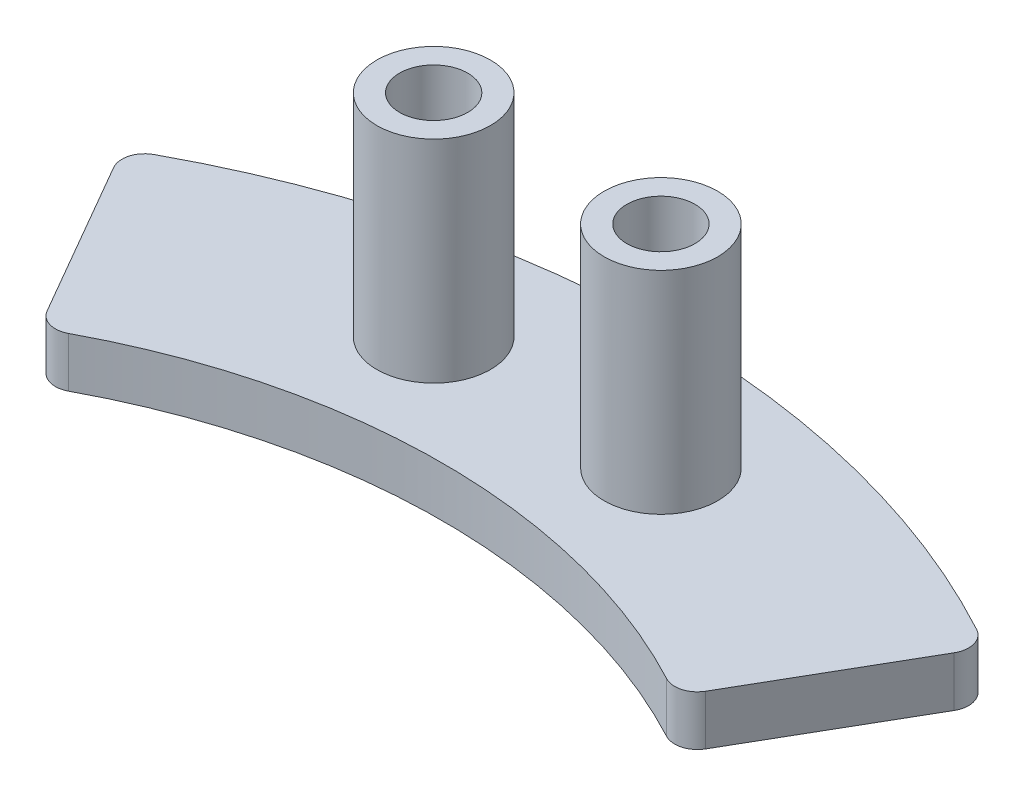
ISO-10303-21;
HEADER;
FILE_DESCRIPTION(('STEP AP214'),'2;1');
FILE_NAME('part.step','',(''),(''),'','','');
FILE_SCHEMA(('AUTOMOTIVE_DESIGN { 1 0 10303 214 1 1 1 1 }'));
ENDSEC;
DATA;
#1=APPLICATION_CONTEXT('core data for automotive mechanical design processes');
#2=APPLICATION_PROTOCOL_DEFINITION('international standard','automotive_design',2000,#1);
#3=PRODUCT_CONTEXT('',#1,'mechanical');
#4=PRODUCT('Part','Part','',(#3));
#5=PRODUCT_RELATED_PRODUCT_CATEGORY('part','',(#4));
#6=PRODUCT_DEFINITION_FORMATION('','',#4);
#7=PRODUCT_DEFINITION_CONTEXT('part definition',#1,'design');
#8=PRODUCT_DEFINITION('design','',#6,#7);
#9=PRODUCT_DEFINITION_SHAPE('','',#8);
#10=(LENGTH_UNIT() NAMED_UNIT(*) SI_UNIT(.MILLI.,.METRE.));
#11=(NAMED_UNIT(*) PLANE_ANGLE_UNIT() SI_UNIT($,.RADIAN.));
#12=(NAMED_UNIT(*) SI_UNIT($,.STERADIAN.) SOLID_ANGLE_UNIT());
#13=UNCERTAINTY_MEASURE_WITH_UNIT(LENGTH_MEASURE(1.E-05),#10,'distance_accuracy_value','');
#14=(GEOMETRIC_REPRESENTATION_CONTEXT(3) GLOBAL_UNCERTAINTY_ASSIGNED_CONTEXT((#13)) GLOBAL_UNIT_ASSIGNED_CONTEXT((#10,
#11,#12)) REPRESENTATION_CONTEXT('',''));
#15=CARTESIAN_POINT('',(0.,0.,0.));
#16=DIRECTION('',(0.,0.,1.));
#17=DIRECTION('',(1.,0.,0.));
#18=AXIS2_PLACEMENT_3D('',#15,#16,#17);
#19=CARTESIAN_POINT('',(0.,2.2,0.));
#20=DIRECTION('',(0.,-1.,0.));
#21=DIRECTION('',(0.,0.,-1.));
#22=AXIS2_PLACEMENT_3D('',#19,#20,#21);
#23=CYLINDRICAL_SURFACE('',#22,38.);
#24=CARTESIAN_POINT('',(0.,2.2,0.));
#25=DIRECTION('',(0.,1.,0.));
#26=DIRECTION('',(0.,0.,-1.));
#27=AXIS2_PLACEMENT_3D('',#24,#25,#26);
#28=CIRCLE('',#27,38.);
#29=CARTESIAN_POINT('',(18.1036278647203,2.2,-33.4104573170695));
#30=VERTEX_POINT('',#29);
#31=CARTESIAN_POINT('',(-18.1036278647205,2.2,-33.4104573170694));
#32=VERTEX_POINT('',#31);
#33=EDGE_CURVE('E132',#30,#32,#28,.T.);
#34=ORIENTED_EDGE('',*,*,#33,.F.);
#35=DIRECTION('',(0.,-1.,0.));
#36=VECTOR('',#35,1.);
#37=CARTESIAN_POINT('',(18.1036278647203,2.2,-33.4104573170695));
#38=LINE('',#37,#36);
#39=CARTESIAN_POINT('',(18.1036278647203,0.,-33.4104573170695));
#40=VERTEX_POINT('',#39);
#41=EDGE_CURVE('E120',#30,#40,#38,.T.);
#42=ORIENTED_EDGE('',*,*,#41,.T.);
#43=CARTESIAN_POINT('',(0.,0.,0.));
#44=DIRECTION('',(0.,1.,0.));
#45=DIRECTION('',(0.,0.,-1.));
#46=AXIS2_PLACEMENT_3D('',#43,#44,#45);
#47=CIRCLE('',#46,38.);
#48=CARTESIAN_POINT('',(-18.1036278647205,0.,-33.4104573170694));
#49=VERTEX_POINT('',#48);
#50=EDGE_CURVE('E126',#40,#49,#47,.T.);
#51=ORIENTED_EDGE('',*,*,#50,.T.);
#52=DIRECTION('',(0.,-1.,0.));
#53=VECTOR('',#52,1.);
#54=CARTESIAN_POINT('',(-18.1036278647205,2.2,-33.4104573170694));
#55=LINE('',#54,#53);
#56=EDGE_CURVE('E139',#49,#32,#55,.F.);
#57=ORIENTED_EDGE('',*,*,#56,.T.);
#58=EDGE_LOOP('',(#34,#42,#51,#57));
#59=FACE_BOUND('',#58,.T.);
#60=ADVANCED_FACE('F44',(#59),#23,.T.);
#61=CARTESIAN_POINT('',(-19.0000000000001,2.2,-32.9089653438086));
#62=DIRECTION('',(0.866025403784436,0.,-0.500000000000004));
#63=DIRECTION('',(-0.500000000000004,0.,-0.866025403784437));
#64=AXIS2_PLACEMENT_3D('',#61,#62,#63);
#65=PLANE('',#64);
#66=DIRECTION('',(0.500000000000004,0.,0.866025403784436));
#67=VECTOR('',#66,1.);
#68=CARTESIAN_POINT('',(-19.0000000000001,2.2,-32.9089653438086));
#69=LINE('',#68,#67);
#70=CARTESIAN_POINT('',(-18.4932420089071,2.2,-32.0312347560939));
#71=VERTEX_POINT('',#70);
#72=CARTESIAN_POINT('',(-14.4913767461895,2.2,-25.0998007960222));
#73=VERTEX_POINT('',#72);
#74=EDGE_CURVE('E203',#71,#73,#69,.T.);
#75=ORIENTED_EDGE('',*,*,#74,.F.);
#76=DIRECTION('',(0.,-1.,0.));
#77=VECTOR('',#76,1.);
#78=CARTESIAN_POINT('',(-18.4932420089071,2.2,-32.0312347560939));
#79=LINE('',#78,#77);
#80=CARTESIAN_POINT('',(-18.4932420089071,0.,-32.0312347560939));
#81=VERTEX_POINT('',#80);
#82=EDGE_CURVE('E11',#71,#81,#79,.T.);
#83=ORIENTED_EDGE('',*,*,#82,.T.);
#84=DIRECTION('',(0.500000000000004,0.,0.866025403784436));
#85=VECTOR('',#84,1.);
#86=CARTESIAN_POINT('',(-19.0000000000001,0.,-32.9089653438086));
#87=LINE('',#86,#85);
#88=CARTESIAN_POINT('',(-14.4913767461895,0.,-25.0998007960222));
#89=VERTEX_POINT('',#88);
#90=EDGE_CURVE('E145',#81,#89,#87,.T.);
#91=ORIENTED_EDGE('',*,*,#90,.T.);
#92=DIRECTION('',(0.,-1.,0.));
#93=VECTOR('',#92,1.);
#94=CARTESIAN_POINT('',(-14.4913767461895,2.2,-25.0998007960222));
#95=LINE('',#94,#93);
#96=EDGE_CURVE('E53',#89,#73,#95,.F.);
#97=ORIENTED_EDGE('',*,*,#96,.T.);
#98=EDGE_LOOP('',(#75,#83,#91,#97));
#99=FACE_BOUND('',#98,.T.);
#100=ADVANCED_FACE('F205',(#99),#65,.F.);
#101=CARTESIAN_POINT('',(0.,2.2,0.));
#102=DIRECTION('',(0.,-1.,0.));
#103=DIRECTION('',(0.,0.,-1.));
#104=AXIS2_PLACEMENT_3D('',#101,#102,#103);
#105=CYLINDRICAL_SURFACE('',#104,28.);
#106=CARTESIAN_POINT('',(0.,0.,0.));
#107=DIRECTION('',(0.,-1.,0.));
#108=DIRECTION('',(0.,0.,-1.));
#109=AXIS2_PLACEMENT_3D('',#106,#107,#108);
#110=CIRCLE('',#109,28.);
#111=CARTESIAN_POINT('',(-13.1555116409429,0.,-24.7170490444352));
#112=VERTEX_POINT('',#111);
#113=CARTESIAN_POINT('',(13.1555116409427,0.,-24.7170490444353));
#114=VERTEX_POINT('',#113);
#115=EDGE_CURVE('E147',#112,#114,#110,.T.);
#116=ORIENTED_EDGE('',*,*,#115,.T.);
#117=DIRECTION('',(0.,-1.,0.));
#118=VECTOR('',#117,1.);
#119=CARTESIAN_POINT('',(13.1555116409427,2.2,-24.7170490444353));
#120=LINE('',#119,#118);
#121=CARTESIAN_POINT('',(13.1555116409427,2.2,-24.7170490444353));
#122=VERTEX_POINT('',#121);
#123=EDGE_CURVE('E63',#114,#122,#120,.F.);
#124=ORIENTED_EDGE('',*,*,#123,.T.);
#125=CARTESIAN_POINT('',(0.,2.2,0.));
#126=DIRECTION('',(0.,-1.,0.));
#127=DIRECTION('',(0.,0.,-1.));
#128=AXIS2_PLACEMENT_3D('',#125,#126,#127);
#129=CIRCLE('',#128,28.);
#130=CARTESIAN_POINT('',(-13.1555116409429,2.2,-24.7170490444352));
#131=VERTEX_POINT('',#130);
#132=EDGE_CURVE('E213',#131,#122,#129,.T.);
#133=ORIENTED_EDGE('',*,*,#132,.F.);
#134=DIRECTION('',(0.,-1.,0.));
#135=VECTOR('',#134,1.);
#136=CARTESIAN_POINT('',(-13.1555116409429,2.2,-24.7170490444352));
#137=LINE('',#136,#135);
#138=EDGE_CURVE('E195',#131,#112,#137,.T.);
#139=ORIENTED_EDGE('',*,*,#138,.T.);
#140=EDGE_LOOP('',(#116,#124,#133,#139));
#141=FACE_BOUND('',#140,.T.);
#142=ADVANCED_FACE('F211',(#141),#105,.F.);
#143=CARTESIAN_POINT('',(18.9999999999999,2.2,-32.9089653438087));
#144=DIRECTION('',(-0.86602540378444,0.,-0.499999999999998));
#145=DIRECTION('',(-0.499999999999998,0.,0.86602540378444));
#146=AXIS2_PLACEMENT_3D('',#143,#144,#145);
#147=PLANE('',#146);
#148=DIRECTION('',(0.499999999999998,0.,-0.86602540378444));
#149=VECTOR('',#148,1.);
#150=CARTESIAN_POINT('',(18.9999999999999,0.,-32.9089653438087));
#151=LINE('',#150,#149);
#152=CARTESIAN_POINT('',(14.4913767461894,0.,-25.0998007960223));
#153=VERTEX_POINT('',#152);
#154=CARTESIAN_POINT('',(18.4932420089068,0.,-32.031234756094));
#155=VERTEX_POINT('',#154);
#156=EDGE_CURVE('E158',#153,#155,#151,.T.);
#157=ORIENTED_EDGE('',*,*,#156,.T.);
#158=DIRECTION('',(0.,-1.,0.));
#159=VECTOR('',#158,1.);
#160=CARTESIAN_POINT('',(18.4932420089068,2.2,-32.031234756094));
#161=LINE('',#160,#159);
#162=CARTESIAN_POINT('',(18.4932420089068,2.2,-32.031234756094));
#163=VERTEX_POINT('',#162);
#164=EDGE_CURVE('E117',#155,#163,#161,.F.);
#165=ORIENTED_EDGE('',*,*,#164,.T.);
#166=DIRECTION('',(0.499999999999998,0.,-0.86602540378444));
#167=VECTOR('',#166,1.);
#168=CARTESIAN_POINT('',(18.9999999999999,2.2,-32.9089653438087));
#169=LINE('',#168,#167);
#170=CARTESIAN_POINT('',(14.4913767461894,2.2,-25.0998007960223));
#171=VERTEX_POINT('',#170);
#172=EDGE_CURVE('E155',#171,#163,#169,.T.);
#173=ORIENTED_EDGE('',*,*,#172,.F.);
#174=DIRECTION('',(0.,-1.,0.));
#175=VECTOR('',#174,1.);
#176=CARTESIAN_POINT('',(14.4913767461894,2.2,-25.0998007960223));
#177=LINE('',#176,#175);
#178=EDGE_CURVE('E121',#171,#153,#177,.T.);
#179=ORIENTED_EDGE('',*,*,#178,.T.);
#180=EDGE_LOOP('',(#157,#165,#173,#179));
#181=FACE_BOUND('',#180,.T.);
#182=ADVANCED_FACE('F221',(#181),#147,.F.);
#183=CARTESIAN_POINT('',(0.,2.2,0.));
#184=DIRECTION('',(0.,-1.,0.));
#185=DIRECTION('',(0.,0.,-1.));
#186=AXIS2_PLACEMENT_3D('',#183,#184,#185);
#187=PLANE('',#186);
#188=CARTESIAN_POINT('',(5.,2.2,-32.6190128606002));
#189=DIRECTION('',(0.,-1.,0.));
#190=DIRECTION('',(0.,0.,-1.));
#191=AXIS2_PLACEMENT_3D('',#188,#189,#190);
#192=CIRCLE('',#191,2.5);
#193=CARTESIAN_POINT('',(5.,2.2,-35.1190128606002));
#194=VERTEX_POINT('',#193);
#195=EDGE_CURVE('E168',#194,#194,#192,.F.);
#196=ORIENTED_EDGE('',*,*,#195,.F.);
#197=EDGE_LOOP('',(#196));
#198=FACE_BOUND('',#197,.T.);
#199=CARTESIAN_POINT('',(-5.,2.2,-32.6190128606002));
#200=DIRECTION('',(0.,-1.,0.));
#201=DIRECTION('',(0.,0.,-1.));
#202=AXIS2_PLACEMENT_3D('',#199,#200,#201);
#203=CIRCLE('',#202,2.5);
#204=CARTESIAN_POINT('',(-5.,2.2,-35.1190128606002));
#205=VERTEX_POINT('',#204);
#206=EDGE_CURVE('E162',#205,#205,#203,.F.);
#207=ORIENTED_EDGE('',*,*,#206,.F.);
#208=EDGE_LOOP('',(#207));
#209=FACE_BOUND('',#208,.T.);
#210=ORIENTED_EDGE('',*,*,#172,.T.);
#211=CARTESIAN_POINT('',(17.6272166051224,2.2,-32.531234756094));
#212=DIRECTION('',(0.,-1.,0.));
#213=DIRECTION('',(0.,0.,-1.));
#214=AXIS2_PLACEMENT_3D('',#211,#212,#213);
#215=CIRCLE('',#214,1.);
#216=EDGE_CURVE('E193',#163,#30,#215,.F.);
#217=ORIENTED_EDGE('',*,*,#216,.T.);
#218=ORIENTED_EDGE('',*,*,#33,.T.);
#219=CARTESIAN_POINT('',(-17.6272166051226,2.2,-32.5312347560939));
#220=DIRECTION('',(0.,-1.,0.));
#221=DIRECTION('',(0.,0.,-1.));
#222=AXIS2_PLACEMENT_3D('',#219,#220,#221);
#223=CIRCLE('',#222,1.);
#224=EDGE_CURVE('E184',#32,#71,#223,.F.);
#225=ORIENTED_EDGE('',*,*,#224,.T.);
#226=ORIENTED_EDGE('',*,*,#74,.T.);
#227=CARTESIAN_POINT('',(-13.6253513424051,2.2,-25.5998007960222));
#228=DIRECTION('',(0.,-1.,0.));
#229=DIRECTION('',(0.,0.,-1.));
#230=AXIS2_PLACEMENT_3D('',#227,#228,#229);
#231=CIRCLE('',#230,1.);
#232=EDGE_CURVE('E67',#73,#131,#231,.F.);
#233=ORIENTED_EDGE('',*,*,#232,.T.);
#234=ORIENTED_EDGE('',*,*,#132,.T.);
#235=CARTESIAN_POINT('',(13.6253513424049,2.2,-25.5998007960223));
#236=DIRECTION('',(0.,-1.,0.));
#237=DIRECTION('',(0.,0.,-1.));
#238=AXIS2_PLACEMENT_3D('',#235,#236,#237);
#239=CIRCLE('',#238,1.);
#240=EDGE_CURVE('E189',#122,#171,#239,.F.);
#241=ORIENTED_EDGE('',*,*,#240,.T.);
#242=EDGE_LOOP('',(#210,#217,#218,#225,#226,#233,#234,#241));
#243=FACE_BOUND('',#242,.T.);
#244=ADVANCED_FACE('F206',(#198,#209,#243),#187,.F.);
#245=CARTESIAN_POINT('',(0.,0.,0.));
#246=DIRECTION('',(0.,-1.,0.));
#247=DIRECTION('',(0.,0.,-1.));
#248=AXIS2_PLACEMENT_3D('',#245,#246,#247);
#249=PLANE('',#248);
#250=CARTESIAN_POINT('',(0.,0.,-33.));
#251=DIRECTION('',(0.,-1.,0.));
#252=DIRECTION('',(0.,0.,-1.));
#253=AXIS2_PLACEMENT_3D('',#250,#251,#252);
#254=CIRCLE('',#253,1.5);
#255=CARTESIAN_POINT('',(0.,0.,-34.5));
#256=VERTEX_POINT('',#255);
#257=EDGE_CURVE('E247',#256,#256,#254,.T.);
#258=ORIENTED_EDGE('',*,*,#257,.F.);
#259=EDGE_LOOP('',(#258));
#260=FACE_BOUND('',#259,.T.);
#261=ORIENTED_EDGE('',*,*,#50,.F.);
#262=CARTESIAN_POINT('',(17.6272166051224,0.,-32.531234756094));
#263=DIRECTION('',(0.,-1.,0.));
#264=DIRECTION('',(0.,0.,-1.));
#265=AXIS2_PLACEMENT_3D('',#262,#263,#264);
#266=CIRCLE('',#265,1.);
#267=EDGE_CURVE('E113',#40,#155,#266,.T.);
#268=ORIENTED_EDGE('',*,*,#267,.T.);
#269=ORIENTED_EDGE('',*,*,#156,.F.);
#270=CARTESIAN_POINT('',(13.6253513424049,0.,-25.5998007960223));
#271=DIRECTION('',(0.,-1.,0.));
#272=DIRECTION('',(0.,0.,-1.));
#273=AXIS2_PLACEMENT_3D('',#270,#271,#272);
#274=CIRCLE('',#273,1.);
#275=EDGE_CURVE('E123',#153,#114,#274,.T.);
#276=ORIENTED_EDGE('',*,*,#275,.T.);
#277=ORIENTED_EDGE('',*,*,#115,.F.);
#278=CARTESIAN_POINT('',(-13.6253513424051,0.,-25.5998007960222));
#279=DIRECTION('',(0.,-1.,0.));
#280=DIRECTION('',(0.,0.,-1.));
#281=AXIS2_PLACEMENT_3D('',#278,#279,#280);
#282=CIRCLE('',#281,1.);
#283=EDGE_CURVE('E131',#112,#89,#282,.T.);
#284=ORIENTED_EDGE('',*,*,#283,.T.);
#285=ORIENTED_EDGE('',*,*,#90,.F.);
#286=CARTESIAN_POINT('',(-17.6272166051226,0.,-32.5312347560939));
#287=DIRECTION('',(0.,-1.,0.));
#288=DIRECTION('',(0.,0.,-1.));
#289=AXIS2_PLACEMENT_3D('',#286,#287,#288);
#290=CIRCLE('',#289,1.);
#291=EDGE_CURVE('E137',#81,#49,#290,.T.);
#292=ORIENTED_EDGE('',*,*,#291,.T.);
#293=EDGE_LOOP('',(#261,#268,#269,#276,#277,#284,#285,#292));
#294=FACE_BOUND('',#293,.T.);
#295=ADVANCED_FACE('F140',(#260,#294),#249,.T.);
#296=CARTESIAN_POINT('',(-5.,11.5,-32.6190128606002));
#297=DIRECTION('',(0.,-1.,0.));
#298=DIRECTION('',(0.,0.,-1.));
#299=AXIS2_PLACEMENT_3D('',#296,#297,#298);
#300=CYLINDRICAL_SURFACE('',#299,2.5);
#301=CARTESIAN_POINT('',(-5.,11.5,-32.6190128606002));
#302=DIRECTION('',(0.,1.,0.));
#303=DIRECTION('',(0.,0.,1.));
#304=AXIS2_PLACEMENT_3D('',#301,#302,#303);
#305=CIRCLE('',#304,2.5);
#306=CARTESIAN_POINT('',(-5.,11.5,-30.1190128606002));
#307=VERTEX_POINT('',#306);
#308=EDGE_CURVE('E141',#307,#307,#305,.T.);
#309=ORIENTED_EDGE('',*,*,#308,.F.);
#310=EDGE_LOOP('',(#309));
#311=FACE_BOUND('',#310,.T.);
#312=ORIENTED_EDGE('',*,*,#206,.T.);
#313=EDGE_LOOP('',(#312));
#314=FACE_BOUND('',#313,.T.);
#315=ADVANCED_FACE('F269',(#311,#314),#300,.T.);
#316=CARTESIAN_POINT('',(-5.,11.5,-32.6190128606002));
#317=DIRECTION('',(0.,1.,0.));
#318=DIRECTION('',(0.,0.,1.));
#319=AXIS2_PLACEMENT_3D('',#316,#317,#318);
#320=PLANE('',#319);
#321=CARTESIAN_POINT('',(-5.,11.5,-32.6190128606002));
#322=DIRECTION('',(0.,1.,0.));
#323=DIRECTION('',(0.,0.,1.));
#324=AXIS2_PLACEMENT_3D('',#321,#322,#323);
#325=CIRCLE('',#324,1.5);
#326=CARTESIAN_POINT('',(-5.,11.5,-31.1190128606002));
#327=VERTEX_POINT('',#326);
#328=EDGE_CURVE('E241',#327,#327,#325,.T.);
#329=ORIENTED_EDGE('',*,*,#328,.F.);
#330=EDGE_LOOP('',(#329));
#331=FACE_BOUND('',#330,.T.);
#332=ORIENTED_EDGE('',*,*,#308,.T.);
#333=EDGE_LOOP('',(#332));
#334=FACE_BOUND('',#333,.T.);
#335=ADVANCED_FACE('F271',(#331,#334),#320,.T.);
#336=CARTESIAN_POINT('',(5.,11.5,-32.6190128606002));
#337=DIRECTION('',(0.,-1.,0.));
#338=DIRECTION('',(0.,0.,-1.));
#339=AXIS2_PLACEMENT_3D('',#336,#337,#338);
#340=CYLINDRICAL_SURFACE('',#339,2.5);
#341=CARTESIAN_POINT('',(5.,11.5,-32.6190128606002));
#342=DIRECTION('',(0.,1.,0.));
#343=DIRECTION('',(0.,0.,1.));
#344=AXIS2_PLACEMENT_3D('',#341,#342,#343);
#345=CIRCLE('',#344,2.5);
#346=CARTESIAN_POINT('',(5.,11.5,-30.1190128606002));
#347=VERTEX_POINT('',#346);
#348=EDGE_CURVE('E153',#347,#347,#345,.T.);
#349=ORIENTED_EDGE('',*,*,#348,.F.);
#350=EDGE_LOOP('',(#349));
#351=FACE_BOUND('',#350,.T.);
#352=ORIENTED_EDGE('',*,*,#195,.T.);
#353=EDGE_LOOP('',(#352));
#354=FACE_BOUND('',#353,.T.);
#355=ADVANCED_FACE('F380',(#351,#354),#340,.T.);
#356=CARTESIAN_POINT('',(5.,11.5,-32.6190128606002));
#357=DIRECTION('',(0.,1.,0.));
#358=DIRECTION('',(0.,0.,1.));
#359=AXIS2_PLACEMENT_3D('',#356,#357,#358);
#360=PLANE('',#359);
#361=CARTESIAN_POINT('',(5.,11.5,-32.6190128606002));
#362=DIRECTION('',(0.,1.,0.));
#363=DIRECTION('',(0.,0.,1.));
#364=AXIS2_PLACEMENT_3D('',#361,#362,#363);
#365=CIRCLE('',#364,1.5);
#366=CARTESIAN_POINT('',(5.,11.5,-31.1190128606002));
#367=VERTEX_POINT('',#366);
#368=EDGE_CURVE('E235',#367,#367,#365,.T.);
#369=ORIENTED_EDGE('',*,*,#368,.F.);
#370=EDGE_LOOP('',(#369));
#371=FACE_BOUND('',#370,.T.);
#372=ORIENTED_EDGE('',*,*,#348,.T.);
#373=EDGE_LOOP('',(#372));
#374=FACE_BOUND('',#373,.T.);
#375=ADVANCED_FACE('F370',(#371,#374),#360,.T.);
#376=CARTESIAN_POINT('',(5.,8.,-32.6190128606002));
#377=DIRECTION('',(0.,1.,0.));
#378=DIRECTION('',(0.,0.,1.));
#379=AXIS2_PLACEMENT_3D('',#376,#377,#378);
#380=CYLINDRICAL_SURFACE('',#379,1.5);
#381=CARTESIAN_POINT('',(5.,8.,-32.6190128606002));
#382=DIRECTION('',(0.,1.,0.));
#383=DIRECTION('',(0.,0.,1.));
#384=AXIS2_PLACEMENT_3D('',#381,#382,#383);
#385=CIRCLE('',#384,1.5);
#386=CARTESIAN_POINT('',(5.,8.,-31.1190128606002));
#387=VERTEX_POINT('',#386);
#388=EDGE_CURVE('E236',#387,#387,#385,.T.);
#389=ORIENTED_EDGE('',*,*,#388,.F.);
#390=EDGE_LOOP('',(#389));
#391=FACE_BOUND('',#390,.T.);
#392=ORIENTED_EDGE('',*,*,#368,.T.);
#393=EDGE_LOOP('',(#392));
#394=FACE_BOUND('',#393,.T.);
#395=ADVANCED_FACE('F357',(#391,#394),#380,.F.);
#396=CARTESIAN_POINT('',(5.,8.,-32.6190128606002));
#397=DIRECTION('',(0.,1.,0.));
#398=DIRECTION('',(0.,0.,1.));
#399=AXIS2_PLACEMENT_3D('',#396,#397,#398);
#400=PLANE('',#399);
#401=ORIENTED_EDGE('',*,*,#388,.T.);
#402=EDGE_LOOP('',(#401));
#403=FACE_BOUND('',#402,.T.);
#404=ADVANCED_FACE('F349',(#403),#400,.T.);
#405=CARTESIAN_POINT('',(-5.,8.,-32.6190128606002));
#406=DIRECTION('',(0.,1.,0.));
#407=DIRECTION('',(0.,0.,1.));
#408=AXIS2_PLACEMENT_3D('',#405,#406,#407);
#409=CYLINDRICAL_SURFACE('',#408,1.5);
#410=CARTESIAN_POINT('',(-5.,8.,-32.6190128606002));
#411=DIRECTION('',(0.,1.,0.));
#412=DIRECTION('',(0.,0.,1.));
#413=AXIS2_PLACEMENT_3D('',#410,#411,#412);
#414=CIRCLE('',#413,1.5);
#415=CARTESIAN_POINT('',(-5.,8.,-31.1190128606002));
#416=VERTEX_POINT('',#415);
#417=EDGE_CURVE('E233',#416,#416,#414,.T.);
#418=ORIENTED_EDGE('',*,*,#417,.F.);
#419=EDGE_LOOP('',(#418));
#420=FACE_BOUND('',#419,.T.);
#421=ORIENTED_EDGE('',*,*,#328,.T.);
#422=EDGE_LOOP('',(#421));
#423=FACE_BOUND('',#422,.T.);
#424=ADVANCED_FACE('F340',(#420,#423),#409,.F.);
#425=CARTESIAN_POINT('',(-5.,8.,-32.6190128606002));
#426=DIRECTION('',(0.,1.,0.));
#427=DIRECTION('',(0.,0.,1.));
#428=AXIS2_PLACEMENT_3D('',#425,#426,#427);
#429=PLANE('',#428);
#430=ORIENTED_EDGE('',*,*,#417,.T.);
#431=EDGE_LOOP('',(#430));
#432=FACE_BOUND('',#431,.T.);
#433=ADVANCED_FACE('F263',(#432),#429,.T.);
#434=CARTESIAN_POINT('',(0.,1.,-33.));
#435=DIRECTION('',(0.,-1.,0.));
#436=DIRECTION('',(0.,0.,-1.));
#437=AXIS2_PLACEMENT_3D('',#434,#435,#436);
#438=CYLINDRICAL_SURFACE('',#437,1.5);
#439=CARTESIAN_POINT('',(0.,1.,-33.));
#440=DIRECTION('',(0.,-1.,0.));
#441=DIRECTION('',(0.,0.,-1.));
#442=AXIS2_PLACEMENT_3D('',#439,#440,#441);
#443=CIRCLE('',#442,1.5);
#444=CARTESIAN_POINT('',(0.,1.,-34.5));
#445=VERTEX_POINT('',#444);
#446=EDGE_CURVE('E240',#445,#445,#443,.T.);
#447=ORIENTED_EDGE('',*,*,#446,.F.);
#448=EDGE_LOOP('',(#447));
#449=FACE_BOUND('',#448,.T.);
#450=ORIENTED_EDGE('',*,*,#257,.T.);
#451=EDGE_LOOP('',(#450));
#452=FACE_BOUND('',#451,.T.);
#453=ADVANCED_FACE('F257',(#449,#452),#438,.F.);
#454=CARTESIAN_POINT('',(0.,1.,-33.));
#455=DIRECTION('',(0.,-1.,0.));
#456=DIRECTION('',(0.,0.,-1.));
#457=AXIS2_PLACEMENT_3D('',#454,#455,#456);
#458=PLANE('',#457);
#459=ORIENTED_EDGE('',*,*,#446,.T.);
#460=EDGE_LOOP('',(#459));
#461=FACE_BOUND('',#460,.T.);
#462=ADVANCED_FACE('F258',(#461),#458,.T.);
#463=CARTESIAN_POINT('',(17.6272166051224,2.2,-32.531234756094));
#464=DIRECTION('',(0.,-1.,0.));
#465=DIRECTION('',(0.,0.,-1.));
#466=AXIS2_PLACEMENT_3D('',#463,#464,#465);
#467=CYLINDRICAL_SURFACE('',#466,1.);
#468=ORIENTED_EDGE('',*,*,#216,.F.);
#469=ORIENTED_EDGE('',*,*,#164,.F.);
#470=ORIENTED_EDGE('',*,*,#267,.F.);
#471=ORIENTED_EDGE('',*,*,#41,.F.);
#472=EDGE_LOOP('',(#468,#469,#470,#471));
#473=FACE_BOUND('',#472,.T.);
#474=ADVANCED_FACE('F116',(#473),#467,.T.);
#475=CARTESIAN_POINT('',(13.6253513424049,2.2,-25.5998007960223));
#476=DIRECTION('',(0.,-1.,0.));
#477=DIRECTION('',(0.,0.,-1.));
#478=AXIS2_PLACEMENT_3D('',#475,#476,#477);
#479=CYLINDRICAL_SURFACE('',#478,1.);
#480=ORIENTED_EDGE('',*,*,#240,.F.);
#481=ORIENTED_EDGE('',*,*,#123,.F.);
#482=ORIENTED_EDGE('',*,*,#275,.F.);
#483=ORIENTED_EDGE('',*,*,#178,.F.);
#484=EDGE_LOOP('',(#480,#481,#482,#483));
#485=FACE_BOUND('',#484,.T.);
#486=ADVANCED_FACE('F220',(#485),#479,.T.);
#487=CARTESIAN_POINT('',(-17.6272166051226,2.2,-32.5312347560939));
#488=DIRECTION('',(0.,-1.,0.));
#489=DIRECTION('',(0.,0.,-1.));
#490=AXIS2_PLACEMENT_3D('',#487,#488,#489);
#491=CYLINDRICAL_SURFACE('',#490,1.);
#492=ORIENTED_EDGE('',*,*,#224,.F.);
#493=ORIENTED_EDGE('',*,*,#56,.F.);
#494=ORIENTED_EDGE('',*,*,#291,.F.);
#495=ORIENTED_EDGE('',*,*,#82,.F.);
#496=EDGE_LOOP('',(#492,#493,#494,#495));
#497=FACE_BOUND('',#496,.T.);
#498=ADVANCED_FACE('F287',(#497),#491,.T.);
#499=CARTESIAN_POINT('',(-13.6253513424051,2.2,-25.5998007960222));
#500=DIRECTION('',(0.,-1.,0.));
#501=DIRECTION('',(0.,0.,-1.));
#502=AXIS2_PLACEMENT_3D('',#499,#500,#501);
#503=CYLINDRICAL_SURFACE('',#502,1.);
#504=ORIENTED_EDGE('',*,*,#232,.F.);
#505=ORIENTED_EDGE('',*,*,#96,.F.);
#506=ORIENTED_EDGE('',*,*,#283,.F.);
#507=ORIENTED_EDGE('',*,*,#138,.F.);
#508=EDGE_LOOP('',(#504,#505,#506,#507));
#509=FACE_BOUND('',#508,.T.);
#510=ADVANCED_FACE('F50',(#509),#503,.T.);
#511=CLOSED_SHELL('',(#60,#100,#142,#182,#244,#295,#315,#335,#355,#375,#395,#404,#424,#433,#453,
#462,#474,#486,#498,#510));
#512=MANIFOLD_SOLID_BREP('B2',#511);
#513=ADVANCED_BREP_SHAPE_REPRESENTATION('',(#18,#512),#14);
#514=SHAPE_DEFINITION_REPRESENTATION(#9,#513);
ENDSEC;
END-ISO-10303-21;
